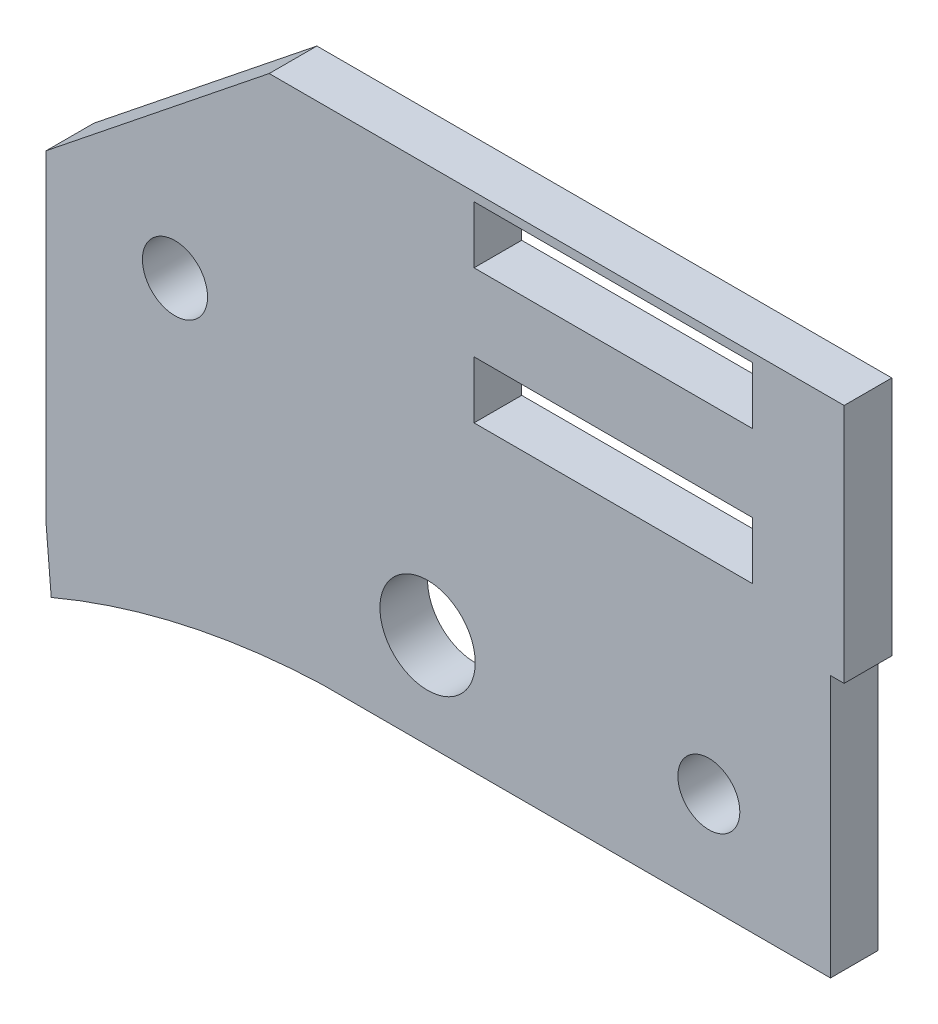
ISO-10303-21;
HEADER;
FILE_DESCRIPTION(('STEP AP214'),'2;1');
FILE_NAME('part.step','',(''),(''),'','','');
FILE_SCHEMA(('AUTOMOTIVE_DESIGN { 1 0 10303 214 1 1 1 1 }'));
ENDSEC;
DATA;
#1=APPLICATION_CONTEXT('core data for automotive mechanical design processes');
#2=APPLICATION_PROTOCOL_DEFINITION('international standard','automotive_design',2000,#1);
#3=PRODUCT_CONTEXT('',#1,'mechanical');
#4=PRODUCT('Part','Part','',(#3));
#5=PRODUCT_RELATED_PRODUCT_CATEGORY('part','',(#4));
#6=PRODUCT_DEFINITION_FORMATION('','',#4);
#7=PRODUCT_DEFINITION_CONTEXT('part definition',#1,'design');
#8=PRODUCT_DEFINITION('design','',#6,#7);
#9=PRODUCT_DEFINITION_SHAPE('','',#8);
#10=(LENGTH_UNIT() NAMED_UNIT(*) SI_UNIT(.MILLI.,.METRE.));
#11=(NAMED_UNIT(*) PLANE_ANGLE_UNIT() SI_UNIT($,.RADIAN.));
#12=(NAMED_UNIT(*) SI_UNIT($,.STERADIAN.) SOLID_ANGLE_UNIT());
#13=UNCERTAINTY_MEASURE_WITH_UNIT(LENGTH_MEASURE(1.E-05),#10,'distance_accuracy_value','');
#14=(GEOMETRIC_REPRESENTATION_CONTEXT(3) GLOBAL_UNCERTAINTY_ASSIGNED_CONTEXT((#13)) GLOBAL_UNIT_ASSIGNED_CONTEXT((#10,
#11,#12)) REPRESENTATION_CONTEXT('',''));
#15=CARTESIAN_POINT('',(0.,0.,0.));
#16=DIRECTION('',(0.,0.,1.));
#17=DIRECTION('',(1.,0.,0.));
#18=AXIS2_PLACEMENT_3D('',#15,#16,#17);
#19=CARTESIAN_POINT('',(19.0672907214581,-48.0018374873372,3.));
#20=DIRECTION('',(0.,0.,1.));
#21=DIRECTION('',(1.,0.,0.));
#22=AXIS2_PLACEMENT_3D('',#19,#20,#21);
#23=PLANE('',#22);
#24=CARTESIAN_POINT('',(41.7,6.2,3.));
#25=DIRECTION('',(0.,0.,1.));
#26=DIRECTION('',(1.,0.,0.));
#27=AXIS2_PLACEMENT_3D('',#24,#25,#26);
#28=CIRCLE('',#27,1.95);
#29=CARTESIAN_POINT('',(43.65,6.2,3.));
#30=VERTEX_POINT('',#29);
#31=EDGE_CURVE('E225',#30,#30,#28,.T.);
#32=ORIENTED_EDGE('',*,*,#31,.F.);
#33=EDGE_LOOP('',(#32));
#34=FACE_BOUND('',#33,.T.);
#35=DIRECTION('',(0.0831379361112907,-0.996538049238038,0.));
#36=VECTOR('',#35,1.);
#37=CARTESIAN_POINT('',(0.,0.,3.));
#38=LINE('',#37,#36);
#39=CARTESIAN_POINT('',(0.,0.,3.));
#40=VERTEX_POINT('',#39);
#41=CARTESIAN_POINT('',(0.315433781537994,-3.7809666684155,3.));
#42=VERTEX_POINT('',#41);
#43=EDGE_CURVE('E237',#40,#42,#38,.T.);
#44=ORIENTED_EDGE('',*,*,#43,.T.);
#45=CARTESIAN_POINT('',(19.0672907214581,-48.0018374873372,3.));
#46=DIRECTION('',(0.,0.,-1.));
#47=DIRECTION('',(1.,0.,0.));
#48=AXIS2_PLACEMENT_3D('',#45,#46,#47);
#49=CIRCLE('',#48,48.0324635499679);
#50=CARTESIAN_POINT('',(17.3523118532913,0.,3.));
#51=VERTEX_POINT('',#50);
#52=EDGE_CURVE('E240',#42,#51,#49,.T.);
#53=ORIENTED_EDGE('',*,*,#52,.T.);
#54=DIRECTION('',(1.,0.,0.));
#55=VECTOR('',#54,1.);
#56=CARTESIAN_POINT('',(17.3523118532913,0.,3.));
#57=LINE('',#56,#55);
#58=CARTESIAN_POINT('',(49.356011681169,0.,3.));
#59=VERTEX_POINT('',#58);
#60=EDGE_CURVE('E243',#51,#59,#57,.T.);
#61=ORIENTED_EDGE('',*,*,#60,.T.);
#62=DIRECTION('',(0.,1.,0.));
#63=VECTOR('',#62,1.);
#64=CARTESIAN_POINT('',(49.356011681169,0.,3.));
#65=LINE('',#64,#63);
#66=CARTESIAN_POINT('',(49.356011681169,16.4847058346689,3.));
#67=VERTEX_POINT('',#66);
#68=EDGE_CURVE('E245',#59,#67,#65,.T.);
#69=ORIENTED_EDGE('',*,*,#68,.T.);
#70=DIRECTION('',(1.,0.,0.));
#71=VECTOR('',#70,1.);
#72=CARTESIAN_POINT('',(49.356011681169,16.4847058346689,3.));
#73=LINE('',#72,#71);
#74=CARTESIAN_POINT('',(50.2131338958292,16.4847058346689,3.));
#75=VERTEX_POINT('',#74);
#76=EDGE_CURVE('E247',#67,#75,#73,.T.);
#77=ORIENTED_EDGE('',*,*,#76,.T.);
#78=DIRECTION('',(0.,1.,0.));
#79=VECTOR('',#78,1.);
#80=CARTESIAN_POINT('',(50.2131338958292,16.4847058346689,3.));
#81=LINE('',#80,#79);
#82=CARTESIAN_POINT('',(50.2131338958292,31.6319733759011,3.));
#83=VERTEX_POINT('',#82);
#84=EDGE_CURVE('E249',#75,#83,#81,.T.);
#85=ORIENTED_EDGE('',*,*,#84,.T.);
#86=DIRECTION('',(-1.,0.,0.));
#87=VECTOR('',#86,1.);
#88=CARTESIAN_POINT('',(14.0339809127557,31.6319733759011,3.));
#89=LINE('',#88,#87);
#90=CARTESIAN_POINT('',(14.0339809127557,31.6319733759011,3.));
#91=VERTEX_POINT('',#90);
#92=EDGE_CURVE('E251',#83,#91,#89,.T.);
#93=ORIENTED_EDGE('',*,*,#92,.T.);
#94=DIRECTION('',(-0.78097573725207,-0.624561364337874,0.));
#95=VECTOR('',#94,1.);
#96=CARTESIAN_POINT('',(14.0339809127557,31.6319733759011,3.));
#97=LINE('',#96,#95);
#98=CARTESIAN_POINT('',(0.,20.4087280843085,3.));
#99=VERTEX_POINT('',#98);
#100=EDGE_CURVE('E253',#91,#99,#97,.T.);
#101=ORIENTED_EDGE('',*,*,#100,.T.);
#102=DIRECTION('',(0.,-1.,0.));
#103=VECTOR('',#102,1.);
#104=CARTESIAN_POINT('',(0.,0.,3.));
#105=LINE('',#104,#103);
#106=EDGE_CURVE('E255',#99,#40,#105,.T.);
#107=ORIENTED_EDGE('',*,*,#106,.T.);
#108=EDGE_LOOP('',(#44,#53,#61,#69,#77,#85,#93,#101,#107));
#109=FACE_BOUND('',#108,.T.);
#110=CARTESIAN_POINT('',(24.,6.,3.));
#111=DIRECTION('',(0.,0.,1.));
#112=DIRECTION('',(1.,0.,0.));
#113=AXIS2_PLACEMENT_3D('',#110,#111,#112);
#114=CIRCLE('',#113,3.);
#115=CARTESIAN_POINT('',(27.,6.,3.));
#116=VERTEX_POINT('',#115);
#117=EDGE_CURVE('E231',#116,#116,#114,.T.);
#118=ORIENTED_EDGE('',*,*,#117,.F.);
#119=EDGE_LOOP('',(#118));
#120=FACE_BOUND('',#119,.T.);
#121=CARTESIAN_POINT('',(8.10388594371031,17.5121682433789,3.));
#122=DIRECTION('',(0.,0.,1.));
#123=DIRECTION('',(1.,0.,0.));
#124=AXIS2_PLACEMENT_3D('',#121,#122,#123);
#125=CIRCLE('',#124,2.05);
#126=CARTESIAN_POINT('',(10.1538859437103,17.5121682433789,3.));
#127=VERTEX_POINT('',#126);
#128=EDGE_CURVE('E219',#127,#127,#125,.T.);
#129=ORIENTED_EDGE('',*,*,#128,.F.);
#130=EDGE_LOOP('',(#129));
#131=FACE_BOUND('',#130,.T.);
#132=DIRECTION('',(1.,0.,0.));
#133=VECTOR('',#132,1.);
#134=CARTESIAN_POINT('',(26.9241274846218,27.4880731023548,3.));
#135=LINE('',#134,#133);
#136=CARTESIAN_POINT('',(26.9241274846218,27.4880731023548,3.));
#137=VERTEX_POINT('',#136);
#138=CARTESIAN_POINT('',(44.4596942075935,27.4880731023548,3.));
#139=VERTEX_POINT('',#138);
#140=EDGE_CURVE('E190',#137,#139,#135,.T.);
#141=ORIENTED_EDGE('',*,*,#140,.F.);
#142=DIRECTION('',(0.,-1.,0.));
#143=VECTOR('',#142,1.);
#144=CARTESIAN_POINT('',(26.9241274846218,31.0880731023548,3.));
#145=LINE('',#144,#143);
#146=CARTESIAN_POINT('',(26.9241274846218,31.0880731023548,3.));
#147=VERTEX_POINT('',#146);
#148=EDGE_CURVE('E188',#147,#137,#145,.T.);
#149=ORIENTED_EDGE('',*,*,#148,.F.);
#150=DIRECTION('',(-1.,0.,0.));
#151=VECTOR('',#150,1.);
#152=CARTESIAN_POINT('',(26.9241274846218,31.0880731023548,3.));
#153=LINE('',#152,#151);
#154=CARTESIAN_POINT('',(44.4596942075935,31.0880731023548,3.));
#155=VERTEX_POINT('',#154);
#156=EDGE_CURVE('E196',#155,#147,#153,.T.);
#157=ORIENTED_EDGE('',*,*,#156,.F.);
#158=DIRECTION('',(0.,1.,0.));
#159=VECTOR('',#158,1.);
#160=CARTESIAN_POINT('',(44.4596942075935,31.0880731023548,3.));
#161=LINE('',#160,#159);
#162=EDGE_CURVE('E193',#139,#155,#161,.T.);
#163=ORIENTED_EDGE('',*,*,#162,.F.);
#164=EDGE_LOOP('',(#141,#149,#157,#163));
#165=FACE_BOUND('',#164,.T.);
#166=DIRECTION('',(1.,0.,0.));
#167=VECTOR('',#166,1.);
#168=CARTESIAN_POINT('',(26.9241274846218,19.0380731023548,3.));
#169=LINE('',#168,#167);
#170=CARTESIAN_POINT('',(26.9241274846218,19.0380731023548,3.));
#171=VERTEX_POINT('',#170);
#172=CARTESIAN_POINT('',(44.4596942075935,19.0380731023548,3.));
#173=VERTEX_POINT('',#172);
#174=EDGE_CURVE('E160',#171,#173,#169,.T.);
#175=ORIENTED_EDGE('',*,*,#174,.F.);
#176=DIRECTION('',(0.,-1.,0.));
#177=VECTOR('',#176,1.);
#178=CARTESIAN_POINT('',(26.9241274846218,22.6380731023548,3.));
#179=LINE('',#178,#177);
#180=CARTESIAN_POINT('',(26.9241274846218,22.6380731023548,3.));
#181=VERTEX_POINT('',#180);
#182=EDGE_CURVE('E152',#181,#171,#179,.T.);
#183=ORIENTED_EDGE('',*,*,#182,.F.);
#184=DIRECTION('',(-1.,0.,0.));
#185=VECTOR('',#184,1.);
#186=CARTESIAN_POINT('',(26.9241274846218,22.6380731023548,3.));
#187=LINE('',#186,#185);
#188=CARTESIAN_POINT('',(44.4596942075935,22.6380731023548,3.));
#189=VERTEX_POINT('',#188);
#190=EDGE_CURVE('E174',#189,#181,#187,.T.);
#191=ORIENTED_EDGE('',*,*,#190,.F.);
#192=DIRECTION('',(0.,1.,0.));
#193=VECTOR('',#192,1.);
#194=CARTESIAN_POINT('',(44.4596942075935,22.6380731023548,3.));
#195=LINE('',#194,#193);
#196=EDGE_CURVE('E172',#173,#189,#195,.T.);
#197=ORIENTED_EDGE('',*,*,#196,.F.);
#198=EDGE_LOOP('',(#175,#183,#191,#197));
#199=FACE_BOUND('',#198,.T.);
#200=ADVANCED_FACE('F33',(#34,#109,#120,#131,#165,#199),#23,.T.);
#201=CARTESIAN_POINT('',(19.0672907214581,-48.0018374873372,0.));
#202=DIRECTION('',(0.,0.,1.));
#203=DIRECTION('',(1.,0.,0.));
#204=AXIS2_PLACEMENT_3D('',#201,#202,#203);
#205=PLANE('',#204);
#206=DIRECTION('',(0.,-1.,0.));
#207=VECTOR('',#206,1.);
#208=CARTESIAN_POINT('',(26.9241274846218,31.0880731023548,0.));
#209=LINE('',#208,#207);
#210=CARTESIAN_POINT('',(26.9241274846218,31.0880731023548,0.));
#211=VERTEX_POINT('',#210);
#212=CARTESIAN_POINT('',(26.9241274846218,27.4880731023548,0.));
#213=VERTEX_POINT('',#212);
#214=EDGE_CURVE('E168',#211,#213,#209,.T.);
#215=ORIENTED_EDGE('',*,*,#214,.T.);
#216=DIRECTION('',(1.,0.,0.));
#217=VECTOR('',#216,1.);
#218=CARTESIAN_POINT('',(26.9241274846218,27.4880731023548,0.));
#219=LINE('',#218,#217);
#220=CARTESIAN_POINT('',(44.4596942075935,27.4880731023548,0.));
#221=VERTEX_POINT('',#220);
#222=EDGE_CURVE('E201',#213,#221,#219,.T.);
#223=ORIENTED_EDGE('',*,*,#222,.T.);
#224=DIRECTION('',(0.,1.,0.));
#225=VECTOR('',#224,1.);
#226=CARTESIAN_POINT('',(44.4596942075935,31.0880731023548,0.));
#227=LINE('',#226,#225);
#228=CARTESIAN_POINT('',(44.4596942075935,31.0880731023548,0.));
#229=VERTEX_POINT('',#228);
#230=EDGE_CURVE('E204',#221,#229,#227,.T.);
#231=ORIENTED_EDGE('',*,*,#230,.T.);
#232=DIRECTION('',(-1.,0.,0.));
#233=VECTOR('',#232,1.);
#234=CARTESIAN_POINT('',(26.9241274846218,31.0880731023548,0.));
#235=LINE('',#234,#233);
#236=EDGE_CURVE('E191',#229,#211,#235,.T.);
#237=ORIENTED_EDGE('',*,*,#236,.T.);
#238=EDGE_LOOP('',(#215,#223,#231,#237));
#239=FACE_BOUND('',#238,.T.);
#240=DIRECTION('',(0.0831379361112907,-0.996538049238038,0.));
#241=VECTOR('',#240,1.);
#242=CARTESIAN_POINT('',(0.,0.,0.));
#243=LINE('',#242,#241);
#244=CARTESIAN_POINT('',(0.,0.,0.));
#245=VERTEX_POINT('',#244);
#246=CARTESIAN_POINT('',(0.315433781537994,-3.7809666684155,0.));
#247=VERTEX_POINT('',#246);
#248=EDGE_CURVE('E234',#245,#247,#243,.T.);
#249=ORIENTED_EDGE('',*,*,#248,.F.);
#250=DIRECTION('',(0.,-1.,0.));
#251=VECTOR('',#250,1.);
#252=CARTESIAN_POINT('',(0.,0.,0.));
#253=LINE('',#252,#251);
#254=CARTESIAN_POINT('',(0.,20.4087280843085,0.));
#255=VERTEX_POINT('',#254);
#256=EDGE_CURVE('E241',#255,#245,#253,.T.);
#257=ORIENTED_EDGE('',*,*,#256,.F.);
#258=DIRECTION('',(-0.78097573725207,-0.624561364337874,0.));
#259=VECTOR('',#258,1.);
#260=CARTESIAN_POINT('',(14.0339809127557,31.6319733759011,0.));
#261=LINE('',#260,#259);
#262=CARTESIAN_POINT('',(14.0339809127557,31.6319733759011,0.));
#263=VERTEX_POINT('',#262);
#264=EDGE_CURVE('E272',#263,#255,#261,.T.);
#265=ORIENTED_EDGE('',*,*,#264,.F.);
#266=DIRECTION('',(-1.,0.,0.));
#267=VECTOR('',#266,1.);
#268=CARTESIAN_POINT('',(14.0339809127557,31.6319733759011,0.));
#269=LINE('',#268,#267);
#270=CARTESIAN_POINT('',(50.2131338958292,31.6319733759011,0.));
#271=VERTEX_POINT('',#270);
#272=EDGE_CURVE('E270',#271,#263,#269,.T.);
#273=ORIENTED_EDGE('',*,*,#272,.F.);
#274=DIRECTION('',(0.,1.,0.));
#275=VECTOR('',#274,1.);
#276=CARTESIAN_POINT('',(50.2131338958292,16.4847058346689,0.));
#277=LINE('',#276,#275);
#278=CARTESIAN_POINT('',(50.2131338958292,16.4847058346689,0.));
#279=VERTEX_POINT('',#278);
#280=EDGE_CURVE('E268',#279,#271,#277,.T.);
#281=ORIENTED_EDGE('',*,*,#280,.F.);
#282=DIRECTION('',(1.,0.,0.));
#283=VECTOR('',#282,1.);
#284=CARTESIAN_POINT('',(49.356011681169,16.4847058346689,0.));
#285=LINE('',#284,#283);
#286=CARTESIAN_POINT('',(49.356011681169,16.4847058346689,0.));
#287=VERTEX_POINT('',#286);
#288=EDGE_CURVE('E266',#287,#279,#285,.T.);
#289=ORIENTED_EDGE('',*,*,#288,.F.);
#290=DIRECTION('',(0.,1.,0.));
#291=VECTOR('',#290,1.);
#292=CARTESIAN_POINT('',(49.356011681169,0.,0.));
#293=LINE('',#292,#291);
#294=CARTESIAN_POINT('',(49.356011681169,0.,0.));
#295=VERTEX_POINT('',#294);
#296=EDGE_CURVE('E264',#295,#287,#293,.T.);
#297=ORIENTED_EDGE('',*,*,#296,.F.);
#298=DIRECTION('',(1.,0.,0.));
#299=VECTOR('',#298,1.);
#300=CARTESIAN_POINT('',(17.3523118532913,0.,0.));
#301=LINE('',#300,#299);
#302=CARTESIAN_POINT('',(17.3523118532913,0.,0.));
#303=VERTEX_POINT('',#302);
#304=EDGE_CURVE('E262',#303,#295,#301,.T.);
#305=ORIENTED_EDGE('',*,*,#304,.F.);
#306=CARTESIAN_POINT('',(19.0672907214581,-48.0018374873372,0.));
#307=DIRECTION('',(0.,0.,-1.));
#308=DIRECTION('',(1.,0.,0.));
#309=AXIS2_PLACEMENT_3D('',#306,#307,#308);
#310=CIRCLE('',#309,48.0324635499679);
#311=EDGE_CURVE('E260',#247,#303,#310,.T.);
#312=ORIENTED_EDGE('',*,*,#311,.F.);
#313=EDGE_LOOP('',(#249,#257,#265,#273,#281,#289,#297,#305,#312));
#314=FACE_BOUND('',#313,.T.);
#315=CARTESIAN_POINT('',(24.,6.,0.));
#316=DIRECTION('',(0.,0.,1.));
#317=DIRECTION('',(1.,0.,0.));
#318=AXIS2_PLACEMENT_3D('',#315,#316,#317);
#319=CIRCLE('',#318,3.);
#320=CARTESIAN_POINT('',(27.,6.,0.));
#321=VERTEX_POINT('',#320);
#322=EDGE_CURVE('E228',#321,#321,#319,.T.);
#323=ORIENTED_EDGE('',*,*,#322,.T.);
#324=EDGE_LOOP('',(#323));
#325=FACE_BOUND('',#324,.T.);
#326=CARTESIAN_POINT('',(41.7,6.2,0.));
#327=DIRECTION('',(0.,0.,1.));
#328=DIRECTION('',(1.,0.,0.));
#329=AXIS2_PLACEMENT_3D('',#326,#327,#328);
#330=CIRCLE('',#329,1.95);
#331=CARTESIAN_POINT('',(43.65,6.2,0.));
#332=VERTEX_POINT('',#331);
#333=EDGE_CURVE('E222',#332,#332,#330,.T.);
#334=ORIENTED_EDGE('',*,*,#333,.T.);
#335=EDGE_LOOP('',(#334));
#336=FACE_BOUND('',#335,.T.);
#337=CARTESIAN_POINT('',(8.10388594371031,17.5121682433789,0.));
#338=DIRECTION('',(0.,0.,1.));
#339=DIRECTION('',(1.,0.,0.));
#340=AXIS2_PLACEMENT_3D('',#337,#338,#339);
#341=CIRCLE('',#340,2.05);
#342=CARTESIAN_POINT('',(10.1538859437103,17.5121682433789,0.));
#343=VERTEX_POINT('',#342);
#344=EDGE_CURVE('E218',#343,#343,#341,.T.);
#345=ORIENTED_EDGE('',*,*,#344,.T.);
#346=EDGE_LOOP('',(#345));
#347=FACE_BOUND('',#346,.T.);
#348=DIRECTION('',(0.,-1.,0.));
#349=VECTOR('',#348,1.);
#350=CARTESIAN_POINT('',(26.9241274846218,22.6380731023548,0.));
#351=LINE('',#350,#349);
#352=CARTESIAN_POINT('',(26.9241274846218,22.6380731023548,0.));
#353=VERTEX_POINT('',#352);
#354=CARTESIAN_POINT('',(26.9241274846218,19.0380731023548,0.));
#355=VERTEX_POINT('',#354);
#356=EDGE_CURVE('E56',#353,#355,#351,.T.);
#357=ORIENTED_EDGE('',*,*,#356,.T.);
#358=DIRECTION('',(1.,0.,0.));
#359=VECTOR('',#358,1.);
#360=CARTESIAN_POINT('',(26.9241274846218,19.0380731023548,0.));
#361=LINE('',#360,#359);
#362=CARTESIAN_POINT('',(44.4596942075935,19.0380731023548,0.));
#363=VERTEX_POINT('',#362);
#364=EDGE_CURVE('E167',#355,#363,#361,.T.);
#365=ORIENTED_EDGE('',*,*,#364,.T.);
#366=DIRECTION('',(0.,1.,0.));
#367=VECTOR('',#366,1.);
#368=CARTESIAN_POINT('',(44.4596942075935,22.6380731023548,0.));
#369=LINE('',#368,#367);
#370=CARTESIAN_POINT('',(44.4596942075935,22.6380731023548,0.));
#371=VERTEX_POINT('',#370);
#372=EDGE_CURVE('E180',#363,#371,#369,.T.);
#373=ORIENTED_EDGE('',*,*,#372,.T.);
#374=DIRECTION('',(-1.,0.,0.));
#375=VECTOR('',#374,1.);
#376=CARTESIAN_POINT('',(26.9241274846218,22.6380731023548,0.));
#377=LINE('',#376,#375);
#378=EDGE_CURVE('E161',#371,#353,#377,.T.);
#379=ORIENTED_EDGE('',*,*,#378,.T.);
#380=EDGE_LOOP('',(#357,#365,#373,#379));
#381=FACE_BOUND('',#380,.T.);
#382=ADVANCED_FACE('F305',(#239,#314,#325,#336,#347,#381),#205,.F.);
#383=CARTESIAN_POINT('',(0.,0.,3.));
#384=DIRECTION('',(0.996538049238038,0.0831379361112907,0.));
#385=DIRECTION('',(-0.0831379361112907,0.996538049238038,0.));
#386=AXIS2_PLACEMENT_3D('',#383,#384,#385);
#387=PLANE('',#386);
#388=ORIENTED_EDGE('',*,*,#248,.T.);
#389=DIRECTION('',(0.,0.,-1.));
#390=VECTOR('',#389,1.);
#391=CARTESIAN_POINT('',(0.315433781537994,-3.7809666684155,3.));
#392=LINE('',#391,#390);
#393=EDGE_CURVE('E11',#42,#247,#392,.T.);
#394=ORIENTED_EDGE('',*,*,#393,.F.);
#395=ORIENTED_EDGE('',*,*,#43,.F.);
#396=DIRECTION('',(0.,0.,-1.));
#397=VECTOR('',#396,1.);
#398=CARTESIAN_POINT('',(0.,0.,3.));
#399=LINE('',#398,#397);
#400=EDGE_CURVE('E257',#40,#245,#399,.T.);
#401=ORIENTED_EDGE('',*,*,#400,.T.);
#402=EDGE_LOOP('',(#388,#394,#395,#401));
#403=FACE_BOUND('',#402,.T.);
#404=ADVANCED_FACE('F35',(#403),#387,.F.);
#405=CARTESIAN_POINT('',(19.0672907214581,-48.0018374873372,3.));
#406=DIRECTION('',(0.,0.,-1.));
#407=DIRECTION('',(-1.,0.,0.));
#408=AXIS2_PLACEMENT_3D('',#405,#406,#407);
#409=CYLINDRICAL_SURFACE('',#408,48.0324635499679);
#410=ORIENTED_EDGE('',*,*,#311,.T.);
#411=DIRECTION('',(0.,0.,-1.));
#412=VECTOR('',#411,1.);
#413=CARTESIAN_POINT('',(17.3523118532913,0.,3.));
#414=LINE('',#413,#412);
#415=EDGE_CURVE('E41',#51,#303,#414,.T.);
#416=ORIENTED_EDGE('',*,*,#415,.F.);
#417=ORIENTED_EDGE('',*,*,#52,.F.);
#418=ORIENTED_EDGE('',*,*,#393,.T.);
#419=EDGE_LOOP('',(#410,#416,#417,#418));
#420=FACE_BOUND('',#419,.T.);
#421=ADVANCED_FACE('F323',(#420),#409,.F.);
#422=CARTESIAN_POINT('',(17.3523118532913,0.,3.));
#423=DIRECTION('',(0.,1.,0.));
#424=DIRECTION('',(0.,0.,1.));
#425=AXIS2_PLACEMENT_3D('',#422,#423,#424);
#426=PLANE('',#425);
#427=ORIENTED_EDGE('',*,*,#304,.T.);
#428=DIRECTION('',(0.,0.,-1.));
#429=VECTOR('',#428,1.);
#430=CARTESIAN_POINT('',(49.356011681169,0.,3.));
#431=LINE('',#430,#429);
#432=EDGE_CURVE('E292',#59,#295,#431,.T.);
#433=ORIENTED_EDGE('',*,*,#432,.F.);
#434=ORIENTED_EDGE('',*,*,#60,.F.);
#435=ORIENTED_EDGE('',*,*,#415,.T.);
#436=EDGE_LOOP('',(#427,#433,#434,#435));
#437=FACE_BOUND('',#436,.T.);
#438=ADVANCED_FACE('F299',(#437),#426,.F.);
#439=CARTESIAN_POINT('',(49.356011681169,0.,3.));
#440=DIRECTION('',(-1.,0.,0.));
#441=DIRECTION('',(0.,0.,1.));
#442=AXIS2_PLACEMENT_3D('',#439,#440,#441);
#443=PLANE('',#442);
#444=ORIENTED_EDGE('',*,*,#296,.T.);
#445=DIRECTION('',(0.,0.,-1.));
#446=VECTOR('',#445,1.);
#447=CARTESIAN_POINT('',(49.356011681169,16.4847058346689,3.));
#448=LINE('',#447,#446);
#449=EDGE_CURVE('E289',#67,#287,#448,.T.);
#450=ORIENTED_EDGE('',*,*,#449,.F.);
#451=ORIENTED_EDGE('',*,*,#68,.F.);
#452=ORIENTED_EDGE('',*,*,#432,.T.);
#453=EDGE_LOOP('',(#444,#450,#451,#452));
#454=FACE_BOUND('',#453,.T.);
#455=ADVANCED_FACE('F311',(#454),#443,.F.);
#456=CARTESIAN_POINT('',(49.356011681169,16.4847058346689,3.));
#457=DIRECTION('',(0.,1.,0.));
#458=DIRECTION('',(0.,0.,1.));
#459=AXIS2_PLACEMENT_3D('',#456,#457,#458);
#460=PLANE('',#459);
#461=ORIENTED_EDGE('',*,*,#288,.T.);
#462=DIRECTION('',(0.,0.,-1.));
#463=VECTOR('',#462,1.);
#464=CARTESIAN_POINT('',(50.2131338958292,16.4847058346689,3.));
#465=LINE('',#464,#463);
#466=EDGE_CURVE('E286',#75,#279,#465,.T.);
#467=ORIENTED_EDGE('',*,*,#466,.F.);
#468=ORIENTED_EDGE('',*,*,#76,.F.);
#469=ORIENTED_EDGE('',*,*,#449,.T.);
#470=EDGE_LOOP('',(#461,#467,#468,#469));
#471=FACE_BOUND('',#470,.T.);
#472=ADVANCED_FACE('F315',(#471),#460,.F.);
#473=CARTESIAN_POINT('',(50.2131338958292,16.4847058346689,3.));
#474=DIRECTION('',(-1.,0.,0.));
#475=DIRECTION('',(0.,0.,1.));
#476=AXIS2_PLACEMENT_3D('',#473,#474,#475);
#477=PLANE('',#476);
#478=ORIENTED_EDGE('',*,*,#280,.T.);
#479=DIRECTION('',(0.,0.,-1.));
#480=VECTOR('',#479,1.);
#481=CARTESIAN_POINT('',(50.2131338958292,31.6319733759011,3.));
#482=LINE('',#481,#480);
#483=EDGE_CURVE('E283',#83,#271,#482,.T.);
#484=ORIENTED_EDGE('',*,*,#483,.F.);
#485=ORIENTED_EDGE('',*,*,#84,.F.);
#486=ORIENTED_EDGE('',*,*,#466,.T.);
#487=EDGE_LOOP('',(#478,#484,#485,#486));
#488=FACE_BOUND('',#487,.T.);
#489=ADVANCED_FACE('F341',(#488),#477,.F.);
#490=CARTESIAN_POINT('',(14.0339809127557,31.6319733759011,3.));
#491=DIRECTION('',(0.,-1.,0.));
#492=DIRECTION('',(0.,0.,-1.));
#493=AXIS2_PLACEMENT_3D('',#490,#491,#492);
#494=PLANE('',#493);
#495=ORIENTED_EDGE('',*,*,#272,.T.);
#496=DIRECTION('',(0.,0.,-1.));
#497=VECTOR('',#496,1.);
#498=CARTESIAN_POINT('',(14.0339809127557,31.6319733759011,3.));
#499=LINE('',#498,#497);
#500=EDGE_CURVE('E280',#91,#263,#499,.T.);
#501=ORIENTED_EDGE('',*,*,#500,.F.);
#502=ORIENTED_EDGE('',*,*,#92,.F.);
#503=ORIENTED_EDGE('',*,*,#483,.T.);
#504=EDGE_LOOP('',(#495,#501,#502,#503));
#505=FACE_BOUND('',#504,.T.);
#506=ADVANCED_FACE('F339',(#505),#494,.F.);
#507=CARTESIAN_POINT('',(14.0339809127557,31.6319733759011,3.));
#508=DIRECTION('',(0.624561364337874,-0.78097573725207,0.));
#509=DIRECTION('',(0.78097573725207,0.624561364337874,0.));
#510=AXIS2_PLACEMENT_3D('',#507,#508,#509);
#511=PLANE('',#510);
#512=ORIENTED_EDGE('',*,*,#264,.T.);
#513=DIRECTION('',(0.,0.,-1.));
#514=VECTOR('',#513,1.);
#515=CARTESIAN_POINT('',(0.,20.4087280843085,3.));
#516=LINE('',#515,#514);
#517=EDGE_CURVE('E277',#99,#255,#516,.T.);
#518=ORIENTED_EDGE('',*,*,#517,.F.);
#519=ORIENTED_EDGE('',*,*,#100,.F.);
#520=ORIENTED_EDGE('',*,*,#500,.T.);
#521=EDGE_LOOP('',(#512,#518,#519,#520));
#522=FACE_BOUND('',#521,.T.);
#523=ADVANCED_FACE('F335',(#522),#511,.F.);
#524=CARTESIAN_POINT('',(0.,0.,3.));
#525=DIRECTION('',(1.,0.,0.));
#526=DIRECTION('',(0.,0.,-1.));
#527=AXIS2_PLACEMENT_3D('',#524,#525,#526);
#528=PLANE('',#527);
#529=ORIENTED_EDGE('',*,*,#256,.T.);
#530=ORIENTED_EDGE('',*,*,#400,.F.);
#531=ORIENTED_EDGE('',*,*,#106,.F.);
#532=ORIENTED_EDGE('',*,*,#517,.T.);
#533=EDGE_LOOP('',(#529,#530,#531,#532));
#534=FACE_BOUND('',#533,.T.);
#535=ADVANCED_FACE('F330',(#534),#528,.F.);
#536=CARTESIAN_POINT('',(24.,6.,3.));
#537=DIRECTION('',(0.,0.,-1.));
#538=DIRECTION('',(-1.,0.,0.));
#539=AXIS2_PLACEMENT_3D('',#536,#537,#538);
#540=CYLINDRICAL_SURFACE('',#539,3.);
#541=ORIENTED_EDGE('',*,*,#117,.T.);
#542=EDGE_LOOP('',(#541));
#543=FACE_BOUND('',#542,.T.);
#544=ORIENTED_EDGE('',*,*,#322,.F.);
#545=EDGE_LOOP('',(#544));
#546=FACE_BOUND('',#545,.T.);
#547=ADVANCED_FACE('F360',(#543,#546),#540,.F.);
#548=CARTESIAN_POINT('',(41.7,6.2,3.));
#549=DIRECTION('',(0.,0.,-1.));
#550=DIRECTION('',(-1.,0.,0.));
#551=AXIS2_PLACEMENT_3D('',#548,#549,#550);
#552=CYLINDRICAL_SURFACE('',#551,1.95);
#553=ORIENTED_EDGE('',*,*,#31,.T.);
#554=EDGE_LOOP('',(#553));
#555=FACE_BOUND('',#554,.T.);
#556=ORIENTED_EDGE('',*,*,#333,.F.);
#557=EDGE_LOOP('',(#556));
#558=FACE_BOUND('',#557,.T.);
#559=ADVANCED_FACE('F380',(#555,#558),#552,.F.);
#560=CARTESIAN_POINT('',(8.10388594371031,17.5121682433789,3.));
#561=DIRECTION('',(0.,0.,-1.));
#562=DIRECTION('',(-1.,0.,0.));
#563=AXIS2_PLACEMENT_3D('',#560,#561,#562);
#564=CYLINDRICAL_SURFACE('',#563,2.05);
#565=ORIENTED_EDGE('',*,*,#128,.T.);
#566=EDGE_LOOP('',(#565));
#567=FACE_BOUND('',#566,.T.);
#568=ORIENTED_EDGE('',*,*,#344,.F.);
#569=EDGE_LOOP('',(#568));
#570=FACE_BOUND('',#569,.T.);
#571=ADVANCED_FACE('F387',(#567,#570),#564,.F.);
#572=CARTESIAN_POINT('',(26.9241274846218,31.0880731023548,3.));
#573=DIRECTION('',(1.,0.,0.));
#574=DIRECTION('',(0.,0.,-1.));
#575=AXIS2_PLACEMENT_3D('',#572,#573,#574);
#576=PLANE('',#575);
#577=ORIENTED_EDGE('',*,*,#214,.F.);
#578=DIRECTION('',(0.,0.,-1.));
#579=VECTOR('',#578,1.);
#580=CARTESIAN_POINT('',(26.9241274846218,31.0880731023548,3.));
#581=LINE('',#580,#579);
#582=EDGE_CURVE('E198',#147,#211,#581,.T.);
#583=ORIENTED_EDGE('',*,*,#582,.F.);
#584=ORIENTED_EDGE('',*,*,#148,.T.);
#585=DIRECTION('',(0.,0.,-1.));
#586=VECTOR('',#585,1.);
#587=CARTESIAN_POINT('',(26.9241274846218,27.4880731023548,3.));
#588=LINE('',#587,#586);
#589=EDGE_CURVE('E215',#137,#213,#588,.T.);
#590=ORIENTED_EDGE('',*,*,#589,.T.);
#591=EDGE_LOOP('',(#577,#583,#584,#590));
#592=FACE_BOUND('',#591,.T.);
#593=ADVANCED_FACE('F394',(#592),#576,.T.);
#594=CARTESIAN_POINT('',(26.9241274846218,27.4880731023548,3.));
#595=DIRECTION('',(0.,1.,0.));
#596=DIRECTION('',(0.,0.,1.));
#597=AXIS2_PLACEMENT_3D('',#594,#595,#596);
#598=PLANE('',#597);
#599=ORIENTED_EDGE('',*,*,#222,.F.);
#600=ORIENTED_EDGE('',*,*,#589,.F.);
#601=ORIENTED_EDGE('',*,*,#140,.T.);
#602=DIRECTION('',(0.,0.,-1.));
#603=VECTOR('',#602,1.);
#604=CARTESIAN_POINT('',(44.4596942075935,27.4880731023548,3.));
#605=LINE('',#604,#603);
#606=EDGE_CURVE('E213',#139,#221,#605,.T.);
#607=ORIENTED_EDGE('',*,*,#606,.T.);
#608=EDGE_LOOP('',(#599,#600,#601,#607));
#609=FACE_BOUND('',#608,.T.);
#610=ADVANCED_FACE('F402',(#609),#598,.T.);
#611=CARTESIAN_POINT('',(44.4596942075935,31.0880731023548,3.));
#612=DIRECTION('',(-1.,0.,0.));
#613=DIRECTION('',(0.,0.,1.));
#614=AXIS2_PLACEMENT_3D('',#611,#612,#613);
#615=PLANE('',#614);
#616=ORIENTED_EDGE('',*,*,#230,.F.);
#617=ORIENTED_EDGE('',*,*,#606,.F.);
#618=ORIENTED_EDGE('',*,*,#162,.T.);
#619=DIRECTION('',(0.,0.,-1.));
#620=VECTOR('',#619,1.);
#621=CARTESIAN_POINT('',(44.4596942075935,31.0880731023548,3.));
#622=LINE('',#621,#620);
#623=EDGE_CURVE('E211',#155,#229,#622,.T.);
#624=ORIENTED_EDGE('',*,*,#623,.T.);
#625=EDGE_LOOP('',(#616,#617,#618,#624));
#626=FACE_BOUND('',#625,.T.);
#627=ADVANCED_FACE('F410',(#626),#615,.T.);
#628=CARTESIAN_POINT('',(26.9241274846218,31.0880731023548,3.));
#629=DIRECTION('',(0.,-1.,0.));
#630=DIRECTION('',(0.,0.,-1.));
#631=AXIS2_PLACEMENT_3D('',#628,#629,#630);
#632=PLANE('',#631);
#633=ORIENTED_EDGE('',*,*,#236,.F.);
#634=ORIENTED_EDGE('',*,*,#623,.F.);
#635=ORIENTED_EDGE('',*,*,#156,.T.);
#636=ORIENTED_EDGE('',*,*,#582,.T.);
#637=EDGE_LOOP('',(#633,#634,#635,#636));
#638=FACE_BOUND('',#637,.T.);
#639=ADVANCED_FACE('F418',(#638),#632,.T.);
#640=CARTESIAN_POINT('',(26.9241274846218,22.6380731023548,3.));
#641=DIRECTION('',(1.,0.,0.));
#642=DIRECTION('',(0.,0.,-1.));
#643=AXIS2_PLACEMENT_3D('',#640,#641,#642);
#644=PLANE('',#643);
#645=ORIENTED_EDGE('',*,*,#356,.F.);
#646=DIRECTION('',(0.,0.,-1.));
#647=VECTOR('',#646,1.);
#648=CARTESIAN_POINT('',(26.9241274846218,22.6380731023548,3.));
#649=LINE('',#648,#647);
#650=EDGE_CURVE('E156',#181,#353,#649,.T.);
#651=ORIENTED_EDGE('',*,*,#650,.F.);
#652=ORIENTED_EDGE('',*,*,#182,.T.);
#653=DIRECTION('',(0.,0.,-1.));
#654=VECTOR('',#653,1.);
#655=CARTESIAN_POINT('',(26.9241274846218,19.0380731023548,3.));
#656=LINE('',#655,#654);
#657=EDGE_CURVE('E155',#171,#355,#656,.T.);
#658=ORIENTED_EDGE('',*,*,#657,.T.);
#659=EDGE_LOOP('',(#645,#651,#652,#658));
#660=FACE_BOUND('',#659,.T.);
#661=ADVANCED_FACE('F154',(#660),#644,.T.);
#662=CARTESIAN_POINT('',(26.9241274846218,19.0380731023548,3.));
#663=DIRECTION('',(0.,1.,0.));
#664=DIRECTION('',(0.,0.,1.));
#665=AXIS2_PLACEMENT_3D('',#662,#663,#664);
#666=PLANE('',#665);
#667=ORIENTED_EDGE('',*,*,#364,.F.);
#668=ORIENTED_EDGE('',*,*,#657,.F.);
#669=ORIENTED_EDGE('',*,*,#174,.T.);
#670=DIRECTION('',(0.,0.,-1.));
#671=VECTOR('',#670,1.);
#672=CARTESIAN_POINT('',(44.4596942075935,19.0380731023548,3.));
#673=LINE('',#672,#671);
#674=EDGE_CURVE('E169',#173,#363,#673,.T.);
#675=ORIENTED_EDGE('',*,*,#674,.T.);
#676=EDGE_LOOP('',(#667,#668,#669,#675));
#677=FACE_BOUND('',#676,.T.);
#678=ADVANCED_FACE('F164',(#677),#666,.T.);
#679=CARTESIAN_POINT('',(44.4596942075935,22.6380731023548,3.));
#680=DIRECTION('',(-1.,0.,0.));
#681=DIRECTION('',(0.,0.,1.));
#682=AXIS2_PLACEMENT_3D('',#679,#680,#681);
#683=PLANE('',#682);
#684=ORIENTED_EDGE('',*,*,#372,.F.);
#685=ORIENTED_EDGE('',*,*,#674,.F.);
#686=ORIENTED_EDGE('',*,*,#196,.T.);
#687=DIRECTION('',(0.,0.,-1.));
#688=VECTOR('',#687,1.);
#689=CARTESIAN_POINT('',(44.4596942075935,22.6380731023548,3.));
#690=LINE('',#689,#688);
#691=EDGE_CURVE('E48',#189,#371,#690,.T.);
#692=ORIENTED_EDGE('',*,*,#691,.T.);
#693=EDGE_LOOP('',(#684,#685,#686,#692));
#694=FACE_BOUND('',#693,.T.);
#695=ADVANCED_FACE('F439',(#694),#683,.T.);
#696=CARTESIAN_POINT('',(26.9241274846218,22.6380731023548,3.));
#697=DIRECTION('',(0.,-1.,0.));
#698=DIRECTION('',(0.,0.,-1.));
#699=AXIS2_PLACEMENT_3D('',#696,#697,#698);
#700=PLANE('',#699);
#701=ORIENTED_EDGE('',*,*,#378,.F.);
#702=ORIENTED_EDGE('',*,*,#691,.F.);
#703=ORIENTED_EDGE('',*,*,#190,.T.);
#704=ORIENTED_EDGE('',*,*,#650,.T.);
#705=EDGE_LOOP('',(#701,#702,#703,#704));
#706=FACE_BOUND('',#705,.T.);
#707=ADVANCED_FACE('F446',(#706),#700,.T.);
#708=CLOSED_SHELL('',(#200,#382,#404,#421,#438,#455,#472,#489,#506,#523,#535,#547,#559,#571,
#593,#610,#627,#639,#661,#678,#695,#707));
#709=MANIFOLD_SOLID_BREP('B2',#708);
#710=ADVANCED_BREP_SHAPE_REPRESENTATION('',(#18,#709),#14);
#711=SHAPE_DEFINITION_REPRESENTATION(#9,#710);
ENDSEC;
END-ISO-10303-21;
